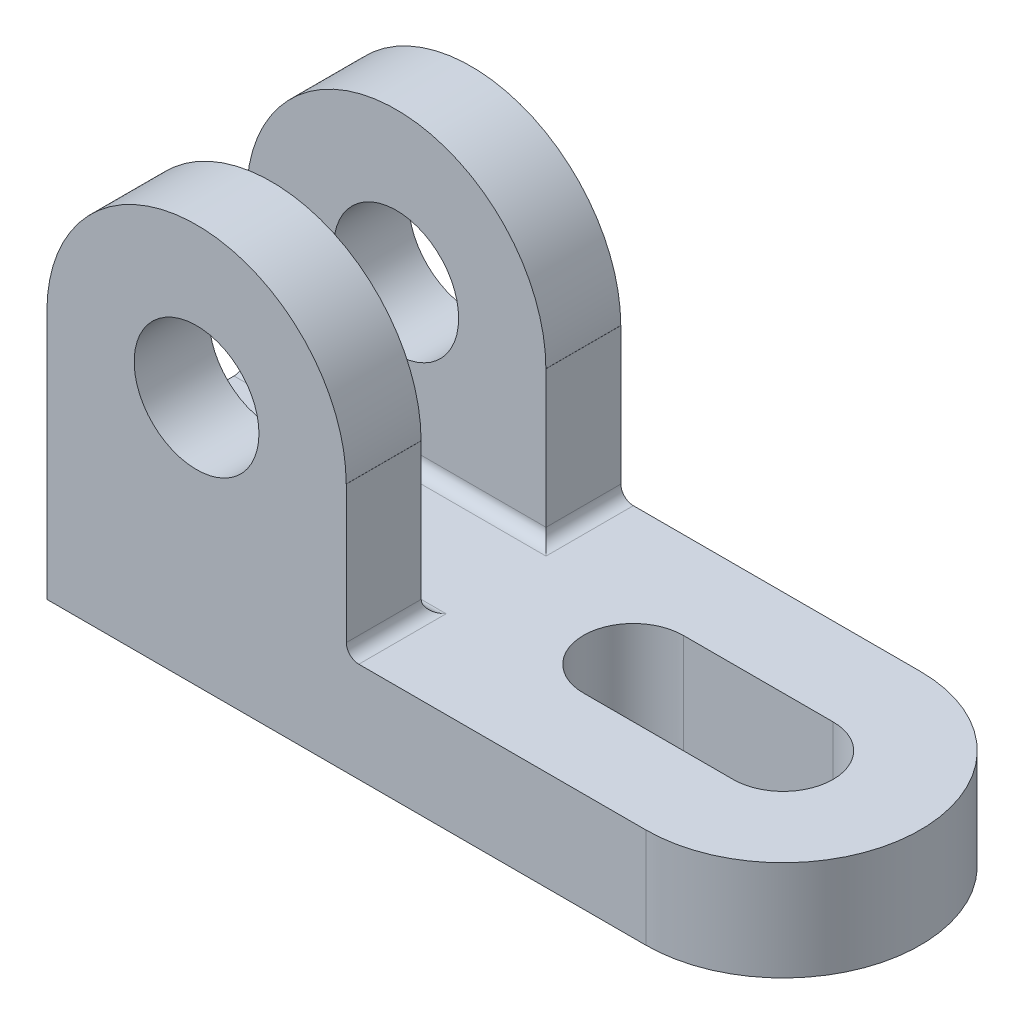
ISO-10303-21;
HEADER;
FILE_DESCRIPTION(('STEP AP214'),'2;1');
FILE_NAME('part.step','',(''),(''),'','','');
FILE_SCHEMA(('AUTOMOTIVE_DESIGN { 1 0 10303 214 1 1 1 1 }'));
ENDSEC;
DATA;
#1=APPLICATION_CONTEXT('core data for automotive mechanical design processes');
#2=APPLICATION_PROTOCOL_DEFINITION('international standard','automotive_design',2000,#1);
#3=PRODUCT_CONTEXT('',#1,'mechanical');
#4=PRODUCT('Part','Part','',(#3));
#5=PRODUCT_RELATED_PRODUCT_CATEGORY('part','',(#4));
#6=PRODUCT_DEFINITION_FORMATION('','',#4);
#7=PRODUCT_DEFINITION_CONTEXT('part definition',#1,'design');
#8=PRODUCT_DEFINITION('design','',#6,#7);
#9=PRODUCT_DEFINITION_SHAPE('','',#8);
#10=(LENGTH_UNIT() NAMED_UNIT(*) SI_UNIT(.MILLI.,.METRE.));
#11=(NAMED_UNIT(*) PLANE_ANGLE_UNIT() SI_UNIT($,.RADIAN.));
#12=(NAMED_UNIT(*) SI_UNIT($,.STERADIAN.) SOLID_ANGLE_UNIT());
#13=UNCERTAINTY_MEASURE_WITH_UNIT(LENGTH_MEASURE(1.E-05),#10,'distance_accuracy_value','');
#14=(GEOMETRIC_REPRESENTATION_CONTEXT(3) GLOBAL_UNCERTAINTY_ASSIGNED_CONTEXT((#13)) GLOBAL_UNIT_ASSIGNED_CONTEXT((#10,
#11,#12)) REPRESENTATION_CONTEXT('',''));
#15=CARTESIAN_POINT('',(0.,0.,0.));
#16=DIRECTION('',(0.,0.,1.));
#17=DIRECTION('',(1.,0.,0.));
#18=AXIS2_PLACEMENT_3D('',#15,#16,#17);
#19=CARTESIAN_POINT('',(0.,16.,0.));
#20=DIRECTION('',(0.,1.,0.));
#21=DIRECTION('',(0.,0.,1.));
#22=AXIS2_PLACEMENT_3D('',#19,#20,#21);
#23=PLANE('',#22);
#24=CARTESIAN_POINT('',(37.,16.,0.));
#25=DIRECTION('',(0.,1.,0.));
#26=DIRECTION('',(0.,0.,1.));
#27=AXIS2_PLACEMENT_3D('',#24,#25,#26);
#28=CIRCLE('',#27,8.00000000000001);
#29=CARTESIAN_POINT('',(37.,16.,8.00000000000001));
#30=VERTEX_POINT('',#29);
#31=CARTESIAN_POINT('',(37.,16.,-8.00000000000001));
#32=VERTEX_POINT('',#31);
#33=EDGE_CURVE('E294',#30,#32,#28,.T.);
#34=ORIENTED_EDGE('',*,*,#33,.F.);
#35=DIRECTION('',(1.,0.,0.));
#36=VECTOR('',#35,1.);
#37=CARTESIAN_POINT('',(37.,16.,8.00000000000001));
#38=LINE('',#37,#36);
#39=CARTESIAN_POINT('',(13.,16.,8.00000000000001));
#40=VERTEX_POINT('',#39);
#41=EDGE_CURVE('E309',#40,#30,#38,.T.);
#42=ORIENTED_EDGE('',*,*,#41,.F.);
#43=CARTESIAN_POINT('',(13.,16.,0.));
#44=DIRECTION('',(0.,1.,0.));
#45=DIRECTION('',(0.,0.,1.));
#46=AXIS2_PLACEMENT_3D('',#43,#44,#45);
#47=CIRCLE('',#46,8.00000000000001);
#48=CARTESIAN_POINT('',(13.,16.,-8.00000000000002));
#49=VERTEX_POINT('',#48);
#50=EDGE_CURVE('E328',#49,#40,#47,.T.);
#51=ORIENTED_EDGE('',*,*,#50,.F.);
#52=DIRECTION('',(-1.,0.,0.));
#53=VECTOR('',#52,1.);
#54=CARTESIAN_POINT('',(37.,16.,-8.00000000000001));
#55=LINE('',#54,#53);
#56=EDGE_CURVE('E324',#32,#49,#55,.T.);
#57=ORIENTED_EDGE('',*,*,#56,.F.);
#58=EDGE_LOOP('',(#34,#42,#51,#57));
#59=FACE_BOUND('',#58,.T.);
#60=DIRECTION('',(0.,0.,-1.));
#61=VECTOR('',#60,1.);
#62=CARTESIAN_POINT('',(-8.99999999999998,16.,0.));
#63=LINE('',#62,#61);
#64=CARTESIAN_POINT('',(-8.99999999999998,16.,-22.));
#65=VERTEX_POINT('',#64);
#66=CARTESIAN_POINT('',(-8.99999999999998,16.,-7.99999999999999));
#67=VERTEX_POINT('',#66);
#68=EDGE_CURVE('E395',#65,#67,#63,.F.);
#69=ORIENTED_EDGE('',*,*,#68,.T.);
#70=DIRECTION('',(-1.,0.,0.));
#71=VECTOR('',#70,1.);
#72=CARTESIAN_POINT('',(0.,16.,-7.99999999999999));
#73=LINE('',#72,#71);
#74=CARTESIAN_POINT('',(-59.,16.,-7.99999999999999));
#75=VERTEX_POINT('',#74);
#76=EDGE_CURVE('E398',#67,#75,#73,.T.);
#77=ORIENTED_EDGE('',*,*,#76,.T.);
#78=DIRECTION('',(0.,0.,-1.));
#79=VECTOR('',#78,1.);
#80=CARTESIAN_POINT('',(-59.,16.,0.));
#81=LINE('',#80,#79);
#82=CARTESIAN_POINT('',(-59.,16.,7.99999999999999));
#83=VERTEX_POINT('',#82);
#84=EDGE_CURVE('E359',#83,#75,#81,.T.);
#85=ORIENTED_EDGE('',*,*,#84,.F.);
#86=DIRECTION('',(-1.,0.,0.));
#87=VECTOR('',#86,1.);
#88=CARTESIAN_POINT('',(0.,16.,7.99999999999999));
#89=LINE('',#88,#87);
#90=CARTESIAN_POINT('',(-8.99999999999998,16.,7.99999999999999));
#91=VERTEX_POINT('',#90);
#92=EDGE_CURVE('E392',#83,#91,#89,.F.);
#93=ORIENTED_EDGE('',*,*,#92,.T.);
#94=DIRECTION('',(0.,0.,1.));
#95=VECTOR('',#94,1.);
#96=CARTESIAN_POINT('',(-8.99999999999998,16.,22.));
#97=LINE('',#96,#95);
#98=CARTESIAN_POINT('',(-8.99999999999998,16.,22.));
#99=VERTEX_POINT('',#98);
#100=EDGE_CURVE('E389',#91,#99,#97,.T.);
#101=ORIENTED_EDGE('',*,*,#100,.T.);
#102=DIRECTION('',(-1.,0.,0.));
#103=VECTOR('',#102,1.);
#104=CARTESIAN_POINT('',(0.,16.,22.));
#105=LINE('',#104,#103);
#106=CARTESIAN_POINT('',(37.,16.,22.));
#107=VERTEX_POINT('',#106);
#108=EDGE_CURVE('E348',#107,#99,#105,.T.);
#109=ORIENTED_EDGE('',*,*,#108,.F.);
#110=CARTESIAN_POINT('',(37.,16.,0.));
#111=DIRECTION('',(0.,1.,0.));
#112=DIRECTION('',(0.,0.,1.));
#113=AXIS2_PLACEMENT_3D('',#110,#111,#112);
#114=CIRCLE('',#113,22.);
#115=CARTESIAN_POINT('',(37.,16.,-22.));
#116=VERTEX_POINT('',#115);
#117=EDGE_CURVE('E351',#107,#116,#114,.T.);
#118=ORIENTED_EDGE('',*,*,#117,.T.);
#119=DIRECTION('',(-1.,0.,0.));
#120=VECTOR('',#119,1.);
#121=CARTESIAN_POINT('',(0.,16.,-22.));
#122=LINE('',#121,#120);
#123=EDGE_CURVE('E355',#116,#65,#122,.T.);
#124=ORIENTED_EDGE('',*,*,#123,.T.);
#125=EDGE_LOOP('',(#69,#77,#85,#93,#101,#109,#118,#124));
#126=FACE_BOUND('',#125,.T.);
#127=ADVANCED_FACE('F40',(#59,#126),#23,.T.);
#128=CARTESIAN_POINT('',(0.,16.,22.));
#129=DIRECTION('',(0.,0.,1.));
#130=DIRECTION('',(1.,0.,0.));
#131=AXIS2_PLACEMENT_3D('',#128,#129,#130);
#132=PLANE('',#131);
#133=DIRECTION('',(-1.,0.,0.));
#134=VECTOR('',#133,1.);
#135=CARTESIAN_POINT('',(0.,0.,22.));
#136=LINE('',#135,#134);
#137=CARTESIAN_POINT('',(37.,0.,22.));
#138=VERTEX_POINT('',#137);
#139=CARTESIAN_POINT('',(-59.,0.,22.));
#140=VERTEX_POINT('',#139);
#141=EDGE_CURVE('E338',#138,#140,#136,.T.);
#142=ORIENTED_EDGE('',*,*,#141,.F.);
#143=DIRECTION('',(0.,-1.,0.));
#144=VECTOR('',#143,1.);
#145=CARTESIAN_POINT('',(37.,16.,22.));
#146=LINE('',#145,#144);
#147=EDGE_CURVE('E386',#107,#138,#146,.T.);
#148=ORIENTED_EDGE('',*,*,#147,.F.);
#149=ORIENTED_EDGE('',*,*,#108,.T.);
#150=CARTESIAN_POINT('',(-8.99999999999998,18.,22.));
#151=DIRECTION('',(0.,0.,1.));
#152=DIRECTION('',(1.,0.,0.));
#153=AXIS2_PLACEMENT_3D('',#150,#151,#152);
#154=CIRCLE('',#153,2.);
#155=CARTESIAN_POINT('',(-11.,18.,22.));
#156=VERTEX_POINT('',#155);
#157=EDGE_CURVE('E11',#99,#156,#154,.F.);
#158=ORIENTED_EDGE('',*,*,#157,.T.);
#159=DIRECTION('',(0.,1.,0.));
#160=VECTOR('',#159,1.);
#161=CARTESIAN_POINT('',(-11.,0.,22.));
#162=LINE('',#161,#160);
#163=CARTESIAN_POINT('',(-11.,40.,22.));
#164=VERTEX_POINT('',#163);
#165=EDGE_CURVE('E260',#156,#164,#162,.T.);
#166=ORIENTED_EDGE('',*,*,#165,.T.);
#167=DIRECTION('',(1.,0.,0.));
#168=VECTOR('',#167,1.);
#169=CARTESIAN_POINT('',(0.,40.,22.));
#170=LINE('',#169,#168);
#171=CARTESIAN_POINT('',(-11.018613653458,40.,22.));
#172=VERTEX_POINT('',#171);
#173=EDGE_CURVE('E279',#172,#164,#170,.T.);
#174=ORIENTED_EDGE('',*,*,#173,.F.);
#175=CARTESIAN_POINT('',(-35.,40.,22.));
#176=DIRECTION('',(0.,0.,1.));
#177=DIRECTION('',(1.,0.,0.));
#178=AXIS2_PLACEMENT_3D('',#175,#176,#177);
#179=CIRCLE('',#178,23.981386346542);
#180=CARTESIAN_POINT('',(-58.981386346542,40.,22.));
#181=VERTEX_POINT('',#180);
#182=EDGE_CURVE('E283',#172,#181,#179,.T.);
#183=ORIENTED_EDGE('',*,*,#182,.T.);
#184=CARTESIAN_POINT('',(-59.,40.,22.));
#185=VERTEX_POINT('',#184);
#186=EDGE_CURVE('E284',#185,#181,#170,.T.);
#187=ORIENTED_EDGE('',*,*,#186,.F.);
#188=DIRECTION('',(0.,-1.,0.));
#189=VECTOR('',#188,1.);
#190=CARTESIAN_POINT('',(-59.,16.,22.));
#191=LINE('',#190,#189);
#192=EDGE_CURVE('E363',#185,#140,#191,.T.);
#193=ORIENTED_EDGE('',*,*,#192,.T.);
#194=EDGE_LOOP('',(#142,#148,#149,#158,#166,#174,#183,#187,#193));
#195=FACE_BOUND('',#194,.T.);
#196=CARTESIAN_POINT('',(-35.,40.,22.));
#197=DIRECTION('',(0.,0.,1.));
#198=DIRECTION('',(1.,0.,0.));
#199=AXIS2_PLACEMENT_3D('',#196,#197,#198);
#200=CIRCLE('',#199,10.);
#201=CARTESIAN_POINT('',(-25.,40.,22.));
#202=VERTEX_POINT('',#201);
#203=EDGE_CURVE('E249',#202,#202,#200,.T.);
#204=ORIENTED_EDGE('',*,*,#203,.F.);
#205=EDGE_LOOP('',(#204));
#206=FACE_BOUND('',#205,.T.);
#207=ADVANCED_FACE('F436',(#195,#206),#132,.T.);
#208=CARTESIAN_POINT('',(37.,16.,0.));
#209=DIRECTION('',(0.,-1.,0.));
#210=DIRECTION('',(0.,0.,-1.));
#211=AXIS2_PLACEMENT_3D('',#208,#209,#210);
#212=CYLINDRICAL_SURFACE('',#211,22.);
#213=CARTESIAN_POINT('',(37.,0.,0.));
#214=DIRECTION('',(0.,1.,0.));
#215=DIRECTION('',(0.,0.,1.));
#216=AXIS2_PLACEMENT_3D('',#213,#214,#215);
#217=CIRCLE('',#216,22.);
#218=CARTESIAN_POINT('',(37.,0.,-22.));
#219=VERTEX_POINT('',#218);
#220=EDGE_CURVE('E367',#138,#219,#217,.T.);
#221=ORIENTED_EDGE('',*,*,#220,.T.);
#222=DIRECTION('',(0.,-1.,0.));
#223=VECTOR('',#222,1.);
#224=CARTESIAN_POINT('',(37.,16.,-22.));
#225=LINE('',#224,#223);
#226=EDGE_CURVE('E382',#116,#219,#225,.T.);
#227=ORIENTED_EDGE('',*,*,#226,.F.);
#228=ORIENTED_EDGE('',*,*,#117,.F.);
#229=ORIENTED_EDGE('',*,*,#147,.T.);
#230=EDGE_LOOP('',(#221,#227,#228,#229));
#231=FACE_BOUND('',#230,.T.);
#232=ADVANCED_FACE('F442',(#231),#212,.T.);
#233=CARTESIAN_POINT('',(0.,16.,-22.));
#234=DIRECTION('',(0.,0.,1.));
#235=DIRECTION('',(1.,0.,0.));
#236=AXIS2_PLACEMENT_3D('',#233,#234,#235);
#237=PLANE('',#236);
#238=DIRECTION('',(-1.,0.,0.));
#239=VECTOR('',#238,1.);
#240=CARTESIAN_POINT('',(0.,0.,-22.));
#241=LINE('',#240,#239);
#242=CARTESIAN_POINT('',(-59.,0.,-22.));
#243=VERTEX_POINT('',#242);
#244=EDGE_CURVE('E370',#219,#243,#241,.T.);
#245=ORIENTED_EDGE('',*,*,#244,.T.);
#246=DIRECTION('',(0.,-1.,0.));
#247=VECTOR('',#246,1.);
#248=CARTESIAN_POINT('',(-59.,16.,-22.));
#249=LINE('',#248,#247);
#250=CARTESIAN_POINT('',(-59.,40.,-22.));
#251=VERTEX_POINT('',#250);
#252=EDGE_CURVE('E379',#251,#243,#249,.T.);
#253=ORIENTED_EDGE('',*,*,#252,.F.);
#254=DIRECTION('',(1.,0.,0.));
#255=VECTOR('',#254,1.);
#256=CARTESIAN_POINT('',(0.,40.,-22.));
#257=LINE('',#256,#255);
#258=CARTESIAN_POINT('',(-58.981386346542,40.,-22.));
#259=VERTEX_POINT('',#258);
#260=EDGE_CURVE('E241',#251,#259,#257,.T.);
#261=ORIENTED_EDGE('',*,*,#260,.T.);
#262=CARTESIAN_POINT('',(-35.,40.,-22.));
#263=DIRECTION('',(0.,0.,1.));
#264=DIRECTION('',(1.,0.,0.));
#265=AXIS2_PLACEMENT_3D('',#262,#263,#264);
#266=CIRCLE('',#265,23.981386346542);
#267=CARTESIAN_POINT('',(-11.018613653458,40.,-22.));
#268=VERTEX_POINT('',#267);
#269=EDGE_CURVE('E219',#268,#259,#266,.T.);
#270=ORIENTED_EDGE('',*,*,#269,.F.);
#271=CARTESIAN_POINT('',(-11.,40.,-22.));
#272=VERTEX_POINT('',#271);
#273=EDGE_CURVE('E237',#268,#272,#257,.T.);
#274=ORIENTED_EDGE('',*,*,#273,.T.);
#275=DIRECTION('',(0.,1.,0.));
#276=VECTOR('',#275,1.);
#277=CARTESIAN_POINT('',(-11.,0.,-22.));
#278=LINE('',#277,#276);
#279=CARTESIAN_POINT('',(-11.,18.,-22.));
#280=VERTEX_POINT('',#279);
#281=EDGE_CURVE('E202',#280,#272,#278,.T.);
#282=ORIENTED_EDGE('',*,*,#281,.F.);
#283=CARTESIAN_POINT('',(-8.99999999999998,18.,-22.));
#284=DIRECTION('',(0.,0.,1.));
#285=DIRECTION('',(1.,0.,0.));
#286=AXIS2_PLACEMENT_3D('',#283,#284,#285);
#287=CIRCLE('',#286,2.);
#288=EDGE_CURVE('E416',#280,#65,#287,.T.);
#289=ORIENTED_EDGE('',*,*,#288,.T.);
#290=ORIENTED_EDGE('',*,*,#123,.F.);
#291=ORIENTED_EDGE('',*,*,#226,.T.);
#292=EDGE_LOOP('',(#245,#253,#261,#270,#274,#282,#289,#290,#291));
#293=FACE_BOUND('',#292,.T.);
#294=CARTESIAN_POINT('',(-35.,40.,-22.));
#295=DIRECTION('',(0.,0.,1.));
#296=DIRECTION('',(1.,0.,0.));
#297=AXIS2_PLACEMENT_3D('',#294,#295,#296);
#298=CIRCLE('',#297,10.);
#299=CARTESIAN_POINT('',(-25.,40.,-22.));
#300=VERTEX_POINT('',#299);
#301=EDGE_CURVE('E233',#300,#300,#298,.T.);
#302=ORIENTED_EDGE('',*,*,#301,.T.);
#303=EDGE_LOOP('',(#302));
#304=FACE_BOUND('',#303,.T.);
#305=ADVANCED_FACE('F480',(#293,#304),#237,.F.);
#306=CARTESIAN_POINT('',(-59.,16.,0.));
#307=DIRECTION('',(-1.,0.,0.));
#308=DIRECTION('',(0.,0.,1.));
#309=AXIS2_PLACEMENT_3D('',#306,#307,#308);
#310=PLANE('',#309);
#311=DIRECTION('',(0.,0.,-1.));
#312=VECTOR('',#311,1.);
#313=CARTESIAN_POINT('',(-59.,0.,0.));
#314=LINE('',#313,#312);
#315=EDGE_CURVE('E352',#140,#243,#314,.T.);
#316=ORIENTED_EDGE('',*,*,#315,.F.);
#317=ORIENTED_EDGE('',*,*,#192,.F.);
#318=DIRECTION('',(0.,0.,1.));
#319=VECTOR('',#318,1.);
#320=CARTESIAN_POINT('',(-59.,40.,9.99999999999999));
#321=LINE('',#320,#319);
#322=CARTESIAN_POINT('',(-59.,40.,9.99999999999999));
#323=VERTEX_POINT('',#322);
#324=EDGE_CURVE('E295',#323,#185,#321,.T.);
#325=ORIENTED_EDGE('',*,*,#324,.F.);
#326=DIRECTION('',(0.,1.,0.));
#327=VECTOR('',#326,1.);
#328=CARTESIAN_POINT('',(-59.,0.,9.99999999999999));
#329=LINE('',#328,#327);
#330=CARTESIAN_POINT('',(-59.,18.,9.99999999999999));
#331=VERTEX_POINT('',#330);
#332=EDGE_CURVE('E269',#331,#323,#329,.T.);
#333=ORIENTED_EDGE('',*,*,#332,.F.);
#334=CARTESIAN_POINT('',(-59.,18.,7.99999999999999));
#335=DIRECTION('',(-1.,0.,0.));
#336=DIRECTION('',(0.,0.,1.));
#337=AXIS2_PLACEMENT_3D('',#334,#335,#336);
#338=CIRCLE('',#337,2.);
#339=EDGE_CURVE('E50',#331,#83,#338,.F.);
#340=ORIENTED_EDGE('',*,*,#339,.T.);
#341=ORIENTED_EDGE('',*,*,#84,.T.);
#342=CARTESIAN_POINT('',(-59.,18.,-7.99999999999999));
#343=DIRECTION('',(-1.,0.,0.));
#344=DIRECTION('',(0.,0.,1.));
#345=AXIS2_PLACEMENT_3D('',#342,#343,#344);
#346=CIRCLE('',#345,2.);
#347=CARTESIAN_POINT('',(-59.,18.,-9.99999999999999));
#348=VERTEX_POINT('',#347);
#349=EDGE_CURVE('E413',#75,#348,#346,.F.);
#350=ORIENTED_EDGE('',*,*,#349,.T.);
#351=DIRECTION('',(0.,1.,0.));
#352=VECTOR('',#351,1.);
#353=CARTESIAN_POINT('',(-59.,0.,-9.99999999999999));
#354=LINE('',#353,#352);
#355=CARTESIAN_POINT('',(-59.,40.,-9.99999999999999));
#356=VERTEX_POINT('',#355);
#357=EDGE_CURVE('E196',#348,#356,#354,.T.);
#358=ORIENTED_EDGE('',*,*,#357,.T.);
#359=DIRECTION('',(0.,0.,-1.));
#360=VECTOR('',#359,1.);
#361=CARTESIAN_POINT('',(-59.,40.,-9.99999999999999));
#362=LINE('',#361,#360);
#363=EDGE_CURVE('E207',#356,#251,#362,.T.);
#364=ORIENTED_EDGE('',*,*,#363,.T.);
#365=ORIENTED_EDGE('',*,*,#252,.T.);
#366=EDGE_LOOP('',(#316,#317,#325,#333,#340,#341,#350,#358,#364,#365));
#367=FACE_BOUND('',#366,.T.);
#368=ADVANCED_FACE('F451',(#367),#310,.T.);
#369=CARTESIAN_POINT('',(0.,0.,0.));
#370=DIRECTION('',(0.,1.,0.));
#371=DIRECTION('',(0.,0.,1.));
#372=AXIS2_PLACEMENT_3D('',#369,#370,#371);
#373=PLANE('',#372);
#374=DIRECTION('',(1.,0.,0.));
#375=VECTOR('',#374,1.);
#376=CARTESIAN_POINT('',(37.,0.,8.00000000000001));
#377=LINE('',#376,#375);
#378=CARTESIAN_POINT('',(13.,0.,8.00000000000001));
#379=VERTEX_POINT('',#378);
#380=CARTESIAN_POINT('',(37.,0.,8.00000000000001));
#381=VERTEX_POINT('',#380);
#382=EDGE_CURVE('E317',#379,#381,#377,.T.);
#383=ORIENTED_EDGE('',*,*,#382,.T.);
#384=CARTESIAN_POINT('',(37.,0.,0.));
#385=DIRECTION('',(0.,1.,0.));
#386=DIRECTION('',(0.,0.,1.));
#387=AXIS2_PLACEMENT_3D('',#384,#385,#386);
#388=CIRCLE('',#387,8.00000000000001);
#389=CARTESIAN_POINT('',(37.,0.,-8.00000000000001));
#390=VERTEX_POINT('',#389);
#391=EDGE_CURVE('E304',#381,#390,#388,.T.);
#392=ORIENTED_EDGE('',*,*,#391,.T.);
#393=DIRECTION('',(-1.,0.,0.));
#394=VECTOR('',#393,1.);
#395=CARTESIAN_POINT('',(37.,0.,-8.00000000000001));
#396=LINE('',#395,#394);
#397=CARTESIAN_POINT('',(13.,0.,-8.00000000000001));
#398=VERTEX_POINT('',#397);
#399=EDGE_CURVE('E308',#390,#398,#396,.T.);
#400=ORIENTED_EDGE('',*,*,#399,.T.);
#401=CARTESIAN_POINT('',(13.,0.,0.));
#402=DIRECTION('',(0.,1.,0.));
#403=DIRECTION('',(0.,0.,1.));
#404=AXIS2_PLACEMENT_3D('',#401,#402,#403);
#405=CIRCLE('',#404,8.00000000000001);
#406=EDGE_CURVE('E313',#398,#379,#405,.T.);
#407=ORIENTED_EDGE('',*,*,#406,.T.);
#408=EDGE_LOOP('',(#383,#392,#400,#407));
#409=FACE_BOUND('',#408,.T.);
#410=ORIENTED_EDGE('',*,*,#141,.T.);
#411=ORIENTED_EDGE('',*,*,#315,.T.);
#412=ORIENTED_EDGE('',*,*,#244,.F.);
#413=ORIENTED_EDGE('',*,*,#220,.F.);
#414=EDGE_LOOP('',(#410,#411,#412,#413));
#415=FACE_BOUND('',#414,.T.);
#416=ADVANCED_FACE('F476',(#409,#415),#373,.F.);
#417=CARTESIAN_POINT('',(37.,0.,0.));
#418=DIRECTION('',(0.,1.,0.));
#419=DIRECTION('',(0.,0.,1.));
#420=AXIS2_PLACEMENT_3D('',#417,#418,#419);
#421=CYLINDRICAL_SURFACE('',#420,8.00000000000001);
#422=ORIENTED_EDGE('',*,*,#33,.T.);
#423=DIRECTION('',(0.,1.,0.));
#424=VECTOR('',#423,1.);
#425=CARTESIAN_POINT('',(37.,0.,-8.00000000000001));
#426=LINE('',#425,#424);
#427=EDGE_CURVE('E321',#390,#32,#426,.T.);
#428=ORIENTED_EDGE('',*,*,#427,.F.);
#429=ORIENTED_EDGE('',*,*,#391,.F.);
#430=DIRECTION('',(0.,1.,0.));
#431=VECTOR('',#430,1.);
#432=CARTESIAN_POINT('',(37.,0.,8.00000000000001));
#433=LINE('',#432,#431);
#434=EDGE_CURVE('E335',#381,#30,#433,.T.);
#435=ORIENTED_EDGE('',*,*,#434,.T.);
#436=EDGE_LOOP('',(#422,#428,#429,#435));
#437=FACE_BOUND('',#436,.T.);
#438=ADVANCED_FACE('F509',(#437),#421,.F.);
#439=CARTESIAN_POINT('',(37.,0.,8.00000000000001));
#440=DIRECTION('',(0.,0.,1.));
#441=DIRECTION('',(1.,0.,0.));
#442=AXIS2_PLACEMENT_3D('',#439,#440,#441);
#443=PLANE('',#442);
#444=ORIENTED_EDGE('',*,*,#41,.T.);
#445=ORIENTED_EDGE('',*,*,#434,.F.);
#446=ORIENTED_EDGE('',*,*,#382,.F.);
#447=DIRECTION('',(0.,1.,0.));
#448=VECTOR('',#447,1.);
#449=CARTESIAN_POINT('',(13.,0.,8.00000000000001));
#450=LINE('',#449,#448);
#451=EDGE_CURVE('E339',#379,#40,#450,.T.);
#452=ORIENTED_EDGE('',*,*,#451,.T.);
#453=EDGE_LOOP('',(#444,#445,#446,#452));
#454=FACE_BOUND('',#453,.T.);
#455=ADVANCED_FACE('F672',(#454),#443,.F.);
#456=CARTESIAN_POINT('',(13.,0.,0.));
#457=DIRECTION('',(0.,1.,0.));
#458=DIRECTION('',(0.,0.,1.));
#459=AXIS2_PLACEMENT_3D('',#456,#457,#458);
#460=CYLINDRICAL_SURFACE('',#459,8.00000000000001);
#461=ORIENTED_EDGE('',*,*,#50,.T.);
#462=ORIENTED_EDGE('',*,*,#451,.F.);
#463=ORIENTED_EDGE('',*,*,#406,.F.);
#464=DIRECTION('',(0.,1.,0.));
#465=VECTOR('',#464,1.);
#466=CARTESIAN_POINT('',(13.,0.,-8.00000000000002));
#467=LINE('',#466,#465);
#468=EDGE_CURVE('E342',#398,#49,#467,.T.);
#469=ORIENTED_EDGE('',*,*,#468,.T.);
#470=EDGE_LOOP('',(#461,#462,#463,#469));
#471=FACE_BOUND('',#470,.T.);
#472=ADVANCED_FACE('F662',(#471),#460,.F.);
#473=CARTESIAN_POINT('',(37.,0.,-8.00000000000001));
#474=DIRECTION('',(0.,0.,-1.));
#475=DIRECTION('',(-1.,0.,0.));
#476=AXIS2_PLACEMENT_3D('',#473,#474,#475);
#477=PLANE('',#476);
#478=ORIENTED_EDGE('',*,*,#56,.T.);
#479=ORIENTED_EDGE('',*,*,#468,.F.);
#480=ORIENTED_EDGE('',*,*,#399,.F.);
#481=ORIENTED_EDGE('',*,*,#427,.T.);
#482=EDGE_LOOP('',(#478,#479,#480,#481));
#483=FACE_BOUND('',#482,.T.);
#484=ADVANCED_FACE('F654',(#483),#477,.F.);
#485=CARTESIAN_POINT('',(0.,40.,9.99999999999999));
#486=DIRECTION('',(0.,-1.,0.));
#487=DIRECTION('',(1.,0.,0.));
#488=AXIS2_PLACEMENT_3D('',#485,#486,#487);
#489=PLANE('',#488);
#490=ORIENTED_EDGE('',*,*,#173,.T.);
#491=DIRECTION('',(0.,0.,1.));
#492=VECTOR('',#491,1.);
#493=CARTESIAN_POINT('',(-11.,40.,9.99999999999999));
#494=LINE('',#493,#492);
#495=CARTESIAN_POINT('',(-11.,40.,9.99999999999999));
#496=VERTEX_POINT('',#495);
#497=EDGE_CURVE('E290',#496,#164,#494,.T.);
#498=ORIENTED_EDGE('',*,*,#497,.F.);
#499=DIRECTION('',(1.,0.,0.));
#500=VECTOR('',#499,1.);
#501=CARTESIAN_POINT('',(0.,40.,9.99999999999999));
#502=LINE('',#501,#500);
#503=CARTESIAN_POINT('',(-11.018613653458,40.,9.99999999999999));
#504=VERTEX_POINT('',#503);
#505=EDGE_CURVE('E259',#504,#496,#502,.T.);
#506=ORIENTED_EDGE('',*,*,#505,.F.);
#507=DIRECTION('',(0.,0.,1.));
#508=VECTOR('',#507,1.);
#509=CARTESIAN_POINT('',(-11.018613653458,40.,9.99999999999999));
#510=LINE('',#509,#508);
#511=EDGE_CURVE('E275',#504,#172,#510,.T.);
#512=ORIENTED_EDGE('',*,*,#511,.T.);
#513=EDGE_LOOP('',(#490,#498,#506,#512));
#514=FACE_BOUND('',#513,.T.);
#515=ADVANCED_FACE('F569',(#514),#489,.F.);
#516=CARTESIAN_POINT('',(-11.,0.,9.99999999999999));
#517=DIRECTION('',(1.,0.,0.));
#518=DIRECTION('',(0.,1.,0.));
#519=AXIS2_PLACEMENT_3D('',#516,#517,#518);
#520=PLANE('',#519);
#521=ORIENTED_EDGE('',*,*,#165,.F.);
#522=DIRECTION('',(0.,0.,1.));
#523=VECTOR('',#522,1.);
#524=CARTESIAN_POINT('',(-11.,18.,9.99999999999999));
#525=LINE('',#524,#523);
#526=CARTESIAN_POINT('',(-11.,18.,9.99999999999999));
#527=VERTEX_POINT('',#526);
#528=EDGE_CURVE('E410',#156,#527,#525,.F.);
#529=ORIENTED_EDGE('',*,*,#528,.T.);
#530=DIRECTION('',(0.,1.,0.));
#531=VECTOR('',#530,1.);
#532=CARTESIAN_POINT('',(-11.,0.,9.99999999999999));
#533=LINE('',#532,#531);
#534=EDGE_CURVE('E272',#527,#496,#533,.T.);
#535=ORIENTED_EDGE('',*,*,#534,.T.);
#536=ORIENTED_EDGE('',*,*,#497,.T.);
#537=EDGE_LOOP('',(#521,#529,#535,#536));
#538=FACE_BOUND('',#537,.T.);
#539=ADVANCED_FACE('F463',(#538),#520,.T.);
#540=ORIENTED_EDGE('',*,*,#186,.T.);
#541=DIRECTION('',(0.,0.,1.));
#542=VECTOR('',#541,1.);
#543=CARTESIAN_POINT('',(-58.981386346542,40.,9.99999999999999));
#544=LINE('',#543,#542);
#545=CARTESIAN_POINT('',(-58.981386346542,40.,9.99999999999999));
#546=VERTEX_POINT('',#545);
#547=EDGE_CURVE('E299',#546,#181,#544,.T.);
#548=ORIENTED_EDGE('',*,*,#547,.F.);
#549=EDGE_CURVE('E265',#323,#546,#502,.T.);
#550=ORIENTED_EDGE('',*,*,#549,.F.);
#551=ORIENTED_EDGE('',*,*,#324,.T.);
#552=EDGE_LOOP('',(#540,#548,#550,#551));
#553=FACE_BOUND('',#552,.T.);
#554=ADVANCED_FACE('F472',(#553),#489,.F.);
#555=CARTESIAN_POINT('',(-35.,40.,9.99999999999999));
#556=DIRECTION('',(0.,0.,1.));
#557=DIRECTION('',(1.,0.,0.));
#558=AXIS2_PLACEMENT_3D('',#555,#556,#557);
#559=CYLINDRICAL_SURFACE('',#558,10.);
#560=CARTESIAN_POINT('',(-35.,40.,9.99999999999999));
#561=DIRECTION('',(0.,0.,1.));
#562=DIRECTION('',(1.,0.,0.));
#563=AXIS2_PLACEMENT_3D('',#560,#561,#562);
#564=CIRCLE('',#563,10.);
#565=CARTESIAN_POINT('',(-25.,40.,9.99999999999999));
#566=VERTEX_POINT('',#565);
#567=EDGE_CURVE('E255',#566,#566,#564,.T.);
#568=ORIENTED_EDGE('',*,*,#567,.F.);
#569=EDGE_LOOP('',(#568));
#570=FACE_BOUND('',#569,.T.);
#571=ORIENTED_EDGE('',*,*,#203,.T.);
#572=EDGE_LOOP('',(#571));
#573=FACE_BOUND('',#572,.T.);
#574=ADVANCED_FACE('F631',(#570,#573),#559,.F.);
#575=CARTESIAN_POINT('',(-35.,40.,9.99999999999999));
#576=DIRECTION('',(0.,0.,1.));
#577=DIRECTION('',(1.,0.,0.));
#578=AXIS2_PLACEMENT_3D('',#575,#576,#577);
#579=CYLINDRICAL_SURFACE('',#578,23.981386346542);
#580=ORIENTED_EDGE('',*,*,#182,.F.);
#581=ORIENTED_EDGE('',*,*,#511,.F.);
#582=CARTESIAN_POINT('',(-35.,40.,9.99999999999999));
#583=DIRECTION('',(0.,0.,1.));
#584=DIRECTION('',(1.,0.,0.));
#585=AXIS2_PLACEMENT_3D('',#582,#583,#584);
#586=CIRCLE('',#585,23.981386346542);
#587=EDGE_CURVE('E264',#504,#546,#586,.T.);
#588=ORIENTED_EDGE('',*,*,#587,.T.);
#589=ORIENTED_EDGE('',*,*,#547,.T.);
#590=EDGE_LOOP('',(#580,#581,#588,#589));
#591=FACE_BOUND('',#590,.T.);
#592=ADVANCED_FACE('F469',(#591),#579,.T.);
#593=CARTESIAN_POINT('',(0.,0.,9.99999999999999));
#594=DIRECTION('',(0.,0.,1.));
#595=DIRECTION('',(1.,0.,0.));
#596=AXIS2_PLACEMENT_3D('',#593,#594,#595);
#597=PLANE('',#596);
#598=ORIENTED_EDGE('',*,*,#567,.T.);
#599=EDGE_LOOP('',(#598));
#600=FACE_BOUND('',#599,.T.);
#601=ORIENTED_EDGE('',*,*,#534,.F.);
#602=DIRECTION('',(-1.,0.,0.));
#603=VECTOR('',#602,1.);
#604=CARTESIAN_POINT('',(0.,18.,9.99999999999999));
#605=LINE('',#604,#603);
#606=EDGE_CURVE('E407',#527,#331,#605,.T.);
#607=ORIENTED_EDGE('',*,*,#606,.T.);
#608=ORIENTED_EDGE('',*,*,#332,.T.);
#609=ORIENTED_EDGE('',*,*,#549,.T.);
#610=ORIENTED_EDGE('',*,*,#587,.F.);
#611=ORIENTED_EDGE('',*,*,#505,.T.);
#612=EDGE_LOOP('',(#601,#607,#608,#609,#610,#611));
#613=FACE_BOUND('',#612,.T.);
#614=ADVANCED_FACE('F457',(#600,#613),#597,.F.);
#615=CARTESIAN_POINT('',(0.,40.,-9.99999999999999));
#616=DIRECTION('',(0.,1.,0.));
#617=DIRECTION('',(-1.,0.,0.));
#618=AXIS2_PLACEMENT_3D('',#615,#616,#617);
#619=PLANE('',#618);
#620=ORIENTED_EDGE('',*,*,#273,.F.);
#621=DIRECTION('',(0.,0.,-1.));
#622=VECTOR('',#621,1.);
#623=CARTESIAN_POINT('',(-11.018613653458,40.,-9.99999999999999));
#624=LINE('',#623,#622);
#625=CARTESIAN_POINT('',(-11.018613653458,40.,-9.99999999999999));
#626=VERTEX_POINT('',#625);
#627=EDGE_CURVE('E211',#626,#268,#624,.T.);
#628=ORIENTED_EDGE('',*,*,#627,.F.);
#629=DIRECTION('',(1.,0.,0.));
#630=VECTOR('',#629,1.);
#631=CARTESIAN_POINT('',(0.,40.,-9.99999999999999));
#632=LINE('',#631,#630);
#633=CARTESIAN_POINT('',(-11.,40.,-9.99999999999999));
#634=VERTEX_POINT('',#633);
#635=EDGE_CURVE('E190',#626,#634,#632,.T.);
#636=ORIENTED_EDGE('',*,*,#635,.T.);
#637=DIRECTION('',(0.,0.,-1.));
#638=VECTOR('',#637,1.);
#639=CARTESIAN_POINT('',(-11.,40.,-9.99999999999999));
#640=LINE('',#639,#638);
#641=EDGE_CURVE('E199',#634,#272,#640,.T.);
#642=ORIENTED_EDGE('',*,*,#641,.T.);
#643=EDGE_LOOP('',(#620,#628,#636,#642));
#644=FACE_BOUND('',#643,.T.);
#645=ADVANCED_FACE('F210',(#644),#619,.T.);
#646=CARTESIAN_POINT('',(-35.,40.,-9.99999999999999));
#647=DIRECTION('',(0.,0.,-1.));
#648=DIRECTION('',(-1.,0.,0.));
#649=AXIS2_PLACEMENT_3D('',#646,#647,#648);
#650=CYLINDRICAL_SURFACE('',#649,23.981386346542);
#651=ORIENTED_EDGE('',*,*,#269,.T.);
#652=DIRECTION('',(0.,0.,-1.));
#653=VECTOR('',#652,1.);
#654=CARTESIAN_POINT('',(-58.981386346542,40.,-9.99999999999999));
#655=LINE('',#654,#653);
#656=CARTESIAN_POINT('',(-58.981386346542,40.,-9.99999999999999));
#657=VERTEX_POINT('',#656);
#658=EDGE_CURVE('E250',#657,#259,#655,.T.);
#659=ORIENTED_EDGE('',*,*,#658,.F.);
#660=CARTESIAN_POINT('',(-35.,40.,-9.99999999999999));
#661=DIRECTION('',(0.,0.,1.));
#662=DIRECTION('',(1.,0.,0.));
#663=AXIS2_PLACEMENT_3D('',#660,#661,#662);
#664=CIRCLE('',#663,23.981386346542);
#665=EDGE_CURVE('E208',#626,#657,#664,.T.);
#666=ORIENTED_EDGE('',*,*,#665,.F.);
#667=ORIENTED_EDGE('',*,*,#627,.T.);
#668=EDGE_LOOP('',(#651,#659,#666,#667));
#669=FACE_BOUND('',#668,.T.);
#670=ADVANCED_FACE('F496',(#669),#650,.T.);
#671=ORIENTED_EDGE('',*,*,#260,.F.);
#672=ORIENTED_EDGE('',*,*,#363,.F.);
#673=EDGE_CURVE('E216',#356,#657,#632,.T.);
#674=ORIENTED_EDGE('',*,*,#673,.T.);
#675=ORIENTED_EDGE('',*,*,#658,.T.);
#676=EDGE_LOOP('',(#671,#672,#674,#675));
#677=FACE_BOUND('',#676,.T.);
#678=ADVANCED_FACE('F488',(#677),#619,.T.);
#679=CARTESIAN_POINT('',(-35.,40.,-9.99999999999999));
#680=DIRECTION('',(0.,0.,-1.));
#681=DIRECTION('',(-1.,0.,0.));
#682=AXIS2_PLACEMENT_3D('',#679,#680,#681);
#683=CYLINDRICAL_SURFACE('',#682,10.);
#684=CARTESIAN_POINT('',(-35.,40.,-9.99999999999999));
#685=DIRECTION('',(0.,0.,1.));
#686=DIRECTION('',(1.,0.,0.));
#687=AXIS2_PLACEMENT_3D('',#684,#685,#686);
#688=CIRCLE('',#687,10.);
#689=CARTESIAN_POINT('',(-25.,40.,-9.99999999999999));
#690=VERTEX_POINT('',#689);
#691=EDGE_CURVE('E214',#690,#690,#688,.T.);
#692=ORIENTED_EDGE('',*,*,#691,.T.);
#693=EDGE_LOOP('',(#692));
#694=FACE_BOUND('',#693,.T.);
#695=ORIENTED_EDGE('',*,*,#301,.F.);
#696=EDGE_LOOP('',(#695));
#697=FACE_BOUND('',#696,.T.);
#698=ADVANCED_FACE('F486',(#694,#697),#683,.F.);
#699=CARTESIAN_POINT('',(-11.,0.,-9.99999999999999));
#700=DIRECTION('',(-1.,0.,0.));
#701=DIRECTION('',(0.,-1.,0.));
#702=AXIS2_PLACEMENT_3D('',#699,#700,#701);
#703=PLANE('',#702);
#704=DIRECTION('',(0.,1.,0.));
#705=VECTOR('',#704,1.);
#706=CARTESIAN_POINT('',(-11.,0.,-9.99999999999999));
#707=LINE('',#706,#705);
#708=CARTESIAN_POINT('',(-11.,18.,-9.99999999999999));
#709=VERTEX_POINT('',#708);
#710=EDGE_CURVE('E185',#709,#634,#707,.T.);
#711=ORIENTED_EDGE('',*,*,#710,.F.);
#712=DIRECTION('',(0.,0.,-1.));
#713=VECTOR('',#712,1.);
#714=CARTESIAN_POINT('',(-11.,18.,-9.99999999999999));
#715=LINE('',#714,#713);
#716=EDGE_CURVE('E404',#709,#280,#715,.T.);
#717=ORIENTED_EDGE('',*,*,#716,.T.);
#718=ORIENTED_EDGE('',*,*,#281,.T.);
#719=ORIENTED_EDGE('',*,*,#641,.F.);
#720=EDGE_LOOP('',(#711,#717,#718,#719));
#721=FACE_BOUND('',#720,.T.);
#722=ADVANCED_FACE('F200',(#721),#703,.F.);
#723=CARTESIAN_POINT('',(0.,0.,-9.99999999999999));
#724=DIRECTION('',(0.,0.,-1.));
#725=DIRECTION('',(1.,0.,0.));
#726=AXIS2_PLACEMENT_3D('',#723,#724,#725);
#727=PLANE('',#726);
#728=ORIENTED_EDGE('',*,*,#691,.F.);
#729=EDGE_LOOP('',(#728));
#730=FACE_BOUND('',#729,.T.);
#731=ORIENTED_EDGE('',*,*,#357,.F.);
#732=DIRECTION('',(-1.,0.,0.));
#733=VECTOR('',#732,1.);
#734=CARTESIAN_POINT('',(0.,18.,-9.99999999999999));
#735=LINE('',#734,#733);
#736=EDGE_CURVE('E192',#348,#709,#735,.F.);
#737=ORIENTED_EDGE('',*,*,#736,.T.);
#738=ORIENTED_EDGE('',*,*,#710,.T.);
#739=ORIENTED_EDGE('',*,*,#635,.F.);
#740=ORIENTED_EDGE('',*,*,#665,.T.);
#741=ORIENTED_EDGE('',*,*,#673,.F.);
#742=EDGE_LOOP('',(#731,#737,#738,#739,#740,#741));
#743=FACE_BOUND('',#742,.T.);
#744=ADVANCED_FACE('F188',(#730,#743),#727,.F.);
#745=CARTESIAN_POINT('',(-8.99999999999998,18.,-9.99999999999999));
#746=DIRECTION('',(0.,0.,-1.));
#747=DIRECTION('',(-1.,0.,0.));
#748=AXIS2_PLACEMENT_3D('',#745,#746,#747);
#749=CYLINDRICAL_SURFACE('',#748,2.);
#750=ORIENTED_EDGE('',*,*,#288,.F.);
#751=ORIENTED_EDGE('',*,*,#716,.F.);
#752=CARTESIAN_POINT('',(-8.99999999999998,18.,-7.99999999999999));
#753=DIRECTION('',(0.707106781186547,0.,-0.707106781186547));
#754=DIRECTION('',(-0.707106781186547,0.,-0.707106781186547));
#755=AXIS2_PLACEMENT_3D('',#752,#753,#754);
#756=ELLIPSE('',#755,2.82842712474619,2.);
#757=EDGE_CURVE('E238',#67,#709,#756,.T.);
#758=ORIENTED_EDGE('',*,*,#757,.F.);
#759=ORIENTED_EDGE('',*,*,#68,.F.);
#760=EDGE_LOOP('',(#750,#751,#758,#759));
#761=FACE_BOUND('',#760,.T.);
#762=ADVANCED_FACE('F448',(#761),#749,.F.);
#763=CARTESIAN_POINT('',(0.,18.,-7.99999999999999));
#764=DIRECTION('',(-1.,0.,0.));
#765=DIRECTION('',(0.,0.,1.));
#766=AXIS2_PLACEMENT_3D('',#763,#764,#765);
#767=CYLINDRICAL_SURFACE('',#766,2.);
#768=ORIENTED_EDGE('',*,*,#757,.T.);
#769=ORIENTED_EDGE('',*,*,#736,.F.);
#770=ORIENTED_EDGE('',*,*,#349,.F.);
#771=ORIENTED_EDGE('',*,*,#76,.F.);
#772=EDGE_LOOP('',(#768,#769,#770,#771));
#773=FACE_BOUND('',#772,.T.);
#774=ADVANCED_FACE('F449',(#773),#767,.F.);
#775=CARTESIAN_POINT('',(-8.99999999999998,18.,0.));
#776=DIRECTION('',(0.,0.,-1.));
#777=DIRECTION('',(-1.,0.,0.));
#778=AXIS2_PLACEMENT_3D('',#775,#776,#777);
#779=CYLINDRICAL_SURFACE('',#778,2.);
#780=ORIENTED_EDGE('',*,*,#157,.F.);
#781=ORIENTED_EDGE('',*,*,#100,.F.);
#782=CARTESIAN_POINT('',(-8.99999999999998,18.,7.99999999999999));
#783=DIRECTION('',(-0.707106781186547,0.,-0.707106781186547));
#784=DIRECTION('',(0.707106781186547,0.,-0.707106781186547));
#785=AXIS2_PLACEMENT_3D('',#782,#783,#784);
#786=ELLIPSE('',#785,2.82842712474619,2.);
#787=EDGE_CURVE('E44',#527,#91,#786,.F.);
#788=ORIENTED_EDGE('',*,*,#787,.F.);
#789=ORIENTED_EDGE('',*,*,#528,.F.);
#790=EDGE_LOOP('',(#780,#781,#788,#789));
#791=FACE_BOUND('',#790,.T.);
#792=ADVANCED_FACE('F42',(#791),#779,.F.);
#793=CARTESIAN_POINT('',(0.,18.,7.99999999999999));
#794=DIRECTION('',(-1.,0.,0.));
#795=DIRECTION('',(0.,0.,1.));
#796=AXIS2_PLACEMENT_3D('',#793,#794,#795);
#797=CYLINDRICAL_SURFACE('',#796,2.);
#798=ORIENTED_EDGE('',*,*,#787,.T.);
#799=ORIENTED_EDGE('',*,*,#92,.F.);
#800=ORIENTED_EDGE('',*,*,#339,.F.);
#801=ORIENTED_EDGE('',*,*,#606,.F.);
#802=EDGE_LOOP('',(#798,#799,#800,#801));
#803=FACE_BOUND('',#802,.T.);
#804=ADVANCED_FACE('F428',(#803),#797,.F.);
#805=CLOSED_SHELL('',(#127,#207,#232,#305,#368,#416,#438,#455,#472,#484,#515,#539,#554,#574,
#592,#614,#645,#670,#678,#698,#722,#744,#762,#774,#792,#804));
#806=MANIFOLD_SOLID_BREP('B2',#805);
#807=ADVANCED_BREP_SHAPE_REPRESENTATION('',(#18,#806),#14);
#808=SHAPE_DEFINITION_REPRESENTATION(#9,#807);
ENDSEC;
END-ISO-10303-21;
